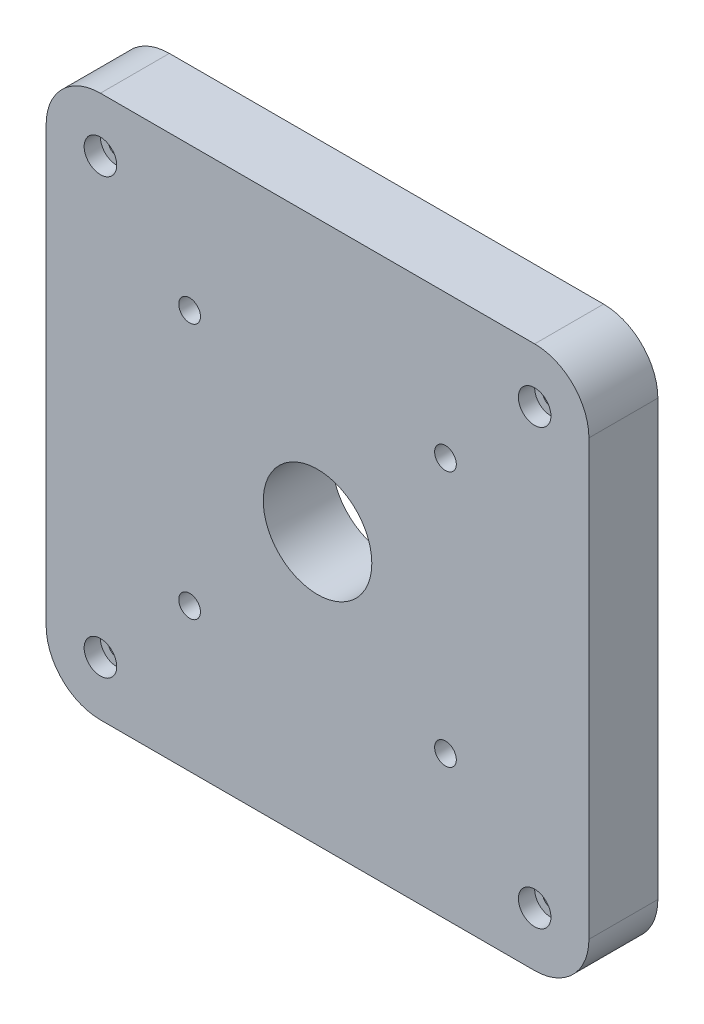
ISO-10303-21;
HEADER;
FILE_DESCRIPTION(('STEP AP214'),'2;1');
FILE_NAME('part.step','',(''),(''),'','','');
FILE_SCHEMA(('AUTOMOTIVE_DESIGN { 1 0 10303 214 1 1 1 1 }'));
ENDSEC;
DATA;
#1=APPLICATION_CONTEXT('core data for automotive mechanical design processes');
#2=APPLICATION_PROTOCOL_DEFINITION('international standard','automotive_design',2000,#1);
#3=PRODUCT_CONTEXT('',#1,'mechanical');
#4=PRODUCT('Part','Part','',(#3));
#5=PRODUCT_RELATED_PRODUCT_CATEGORY('part','',(#4));
#6=PRODUCT_DEFINITION_FORMATION('','',#4);
#7=PRODUCT_DEFINITION_CONTEXT('part definition',#1,'design');
#8=PRODUCT_DEFINITION('design','',#6,#7);
#9=PRODUCT_DEFINITION_SHAPE('','',#8);
#10=(LENGTH_UNIT() NAMED_UNIT(*) SI_UNIT(.MILLI.,.METRE.));
#11=(NAMED_UNIT(*) PLANE_ANGLE_UNIT() SI_UNIT($,.RADIAN.));
#12=(NAMED_UNIT(*) SI_UNIT($,.STERADIAN.) SOLID_ANGLE_UNIT());
#13=UNCERTAINTY_MEASURE_WITH_UNIT(LENGTH_MEASURE(1.E-05),#10,'distance_accuracy_value','');
#14=(GEOMETRIC_REPRESENTATION_CONTEXT(3) GLOBAL_UNCERTAINTY_ASSIGNED_CONTEXT((#13)) GLOBAL_UNIT_ASSIGNED_CONTEXT((#10,
#11,#12)) REPRESENTATION_CONTEXT('',''));
#15=CARTESIAN_POINT('',(0.,0.,0.));
#16=DIRECTION('',(0.,0.,1.));
#17=DIRECTION('',(1.,0.,0.));
#18=AXIS2_PLACEMENT_3D('',#15,#16,#17);
#19=CARTESIAN_POINT('',(26.43,73.57,-18.3));
#20=DIRECTION('',(0.,0.,1.));
#21=DIRECTION('',(1.,0.,0.));
#22=AXIS2_PLACEMENT_3D('',#19,#20,#21);
#23=CYLINDRICAL_SURFACE('',#22,2.);
#24=CARTESIAN_POINT('',(26.43,73.57,12.7));
#25=DIRECTION('',(0.,0.,1.));
#26=DIRECTION('',(1.,0.,0.));
#27=AXIS2_PLACEMENT_3D('',#24,#25,#26);
#28=CIRCLE('',#27,2.);
#29=CARTESIAN_POINT('',(28.43,73.57,12.7));
#30=VERTEX_POINT('',#29);
#31=EDGE_CURVE('E245',#30,#30,#28,.T.);
#32=ORIENTED_EDGE('',*,*,#31,.T.);
#33=EDGE_LOOP('',(#32));
#34=FACE_BOUND('',#33,.T.);
#35=CARTESIAN_POINT('',(26.43,73.57,3.));
#36=DIRECTION('',(0.,0.,-1.));
#37=DIRECTION('',(-1.,0.,0.));
#38=AXIS2_PLACEMENT_3D('',#35,#36,#37);
#39=CIRCLE('',#38,2.);
#40=CARTESIAN_POINT('',(24.43,73.57,3.));
#41=VERTEX_POINT('',#40);
#42=EDGE_CURVE('E47',#41,#41,#39,.F.);
#43=ORIENTED_EDGE('',*,*,#42,.F.);
#44=EDGE_LOOP('',(#43));
#45=FACE_BOUND('',#44,.T.);
#46=ADVANCED_FACE('F43',(#34,#45),#23,.F.);
#47=CARTESIAN_POINT('',(73.57,73.57,-18.3));
#48=DIRECTION('',(0.,0.,1.));
#49=DIRECTION('',(1.,0.,0.));
#50=AXIS2_PLACEMENT_3D('',#47,#48,#49);
#51=CYLINDRICAL_SURFACE('',#50,2.);
#52=CARTESIAN_POINT('',(73.57,73.57,12.7));
#53=DIRECTION('',(0.,0.,1.));
#54=DIRECTION('',(1.,0.,0.));
#55=AXIS2_PLACEMENT_3D('',#52,#53,#54);
#56=CIRCLE('',#55,2.);
#57=CARTESIAN_POINT('',(75.57,73.57,12.7));
#58=VERTEX_POINT('',#57);
#59=EDGE_CURVE('E249',#58,#58,#56,.T.);
#60=ORIENTED_EDGE('',*,*,#59,.T.);
#61=EDGE_LOOP('',(#60));
#62=FACE_BOUND('',#61,.T.);
#63=CARTESIAN_POINT('',(73.57,73.57,3.));
#64=DIRECTION('',(0.,0.,-1.));
#65=DIRECTION('',(-1.,0.,0.));
#66=AXIS2_PLACEMENT_3D('',#63,#64,#65);
#67=CIRCLE('',#66,2.);
#68=CARTESIAN_POINT('',(71.57,73.57,3.));
#69=VERTEX_POINT('',#68);
#70=EDGE_CURVE('E220',#69,#69,#67,.F.);
#71=ORIENTED_EDGE('',*,*,#70,.F.);
#72=EDGE_LOOP('',(#71));
#73=FACE_BOUND('',#72,.T.);
#74=ADVANCED_FACE('F376',(#62,#73),#51,.F.);
#75=CARTESIAN_POINT('',(26.43,26.43,-18.3));
#76=DIRECTION('',(0.,0.,1.));
#77=DIRECTION('',(1.,0.,0.));
#78=AXIS2_PLACEMENT_3D('',#75,#76,#77);
#79=CYLINDRICAL_SURFACE('',#78,2.);
#80=CARTESIAN_POINT('',(26.43,26.43,12.7));
#81=DIRECTION('',(0.,0.,1.));
#82=DIRECTION('',(1.,0.,0.));
#83=AXIS2_PLACEMENT_3D('',#80,#81,#82);
#84=CIRCLE('',#83,2.);
#85=CARTESIAN_POINT('',(28.43,26.43,12.7));
#86=VERTEX_POINT('',#85);
#87=EDGE_CURVE('E253',#86,#86,#84,.T.);
#88=ORIENTED_EDGE('',*,*,#87,.T.);
#89=EDGE_LOOP('',(#88));
#90=FACE_BOUND('',#89,.T.);
#91=CARTESIAN_POINT('',(26.43,26.43,3.));
#92=DIRECTION('',(0.,0.,-1.));
#93=DIRECTION('',(-1.,0.,0.));
#94=AXIS2_PLACEMENT_3D('',#91,#92,#93);
#95=CIRCLE('',#94,2.);
#96=CARTESIAN_POINT('',(24.43,26.43,3.));
#97=VERTEX_POINT('',#96);
#98=EDGE_CURVE('E216',#97,#97,#95,.F.);
#99=ORIENTED_EDGE('',*,*,#98,.F.);
#100=EDGE_LOOP('',(#99));
#101=FACE_BOUND('',#100,.T.);
#102=ADVANCED_FACE('F382',(#90,#101),#79,.F.);
#103=CARTESIAN_POINT('',(73.57,26.43,-18.3));
#104=DIRECTION('',(0.,0.,1.));
#105=DIRECTION('',(1.,0.,0.));
#106=AXIS2_PLACEMENT_3D('',#103,#104,#105);
#107=CYLINDRICAL_SURFACE('',#106,2.);
#108=CARTESIAN_POINT('',(73.57,26.43,12.7));
#109=DIRECTION('',(0.,0.,1.));
#110=DIRECTION('',(1.,0.,0.));
#111=AXIS2_PLACEMENT_3D('',#108,#109,#110);
#112=CIRCLE('',#111,2.);
#113=CARTESIAN_POINT('',(75.57,26.43,12.7));
#114=VERTEX_POINT('',#113);
#115=EDGE_CURVE('E211',#114,#114,#112,.T.);
#116=ORIENTED_EDGE('',*,*,#115,.T.);
#117=EDGE_LOOP('',(#116));
#118=FACE_BOUND('',#117,.T.);
#119=CARTESIAN_POINT('',(73.57,26.43,3.));
#120=DIRECTION('',(0.,0.,-1.));
#121=DIRECTION('',(-1.,0.,0.));
#122=AXIS2_PLACEMENT_3D('',#119,#120,#121);
#123=CIRCLE('',#122,2.);
#124=CARTESIAN_POINT('',(71.57,26.43,3.));
#125=VERTEX_POINT('',#124);
#126=EDGE_CURVE('E212',#125,#125,#123,.F.);
#127=ORIENTED_EDGE('',*,*,#126,.F.);
#128=EDGE_LOOP('',(#127));
#129=FACE_BOUND('',#128,.T.);
#130=ADVANCED_FACE('F392',(#118,#129),#107,.F.);
#131=CARTESIAN_POINT('',(90.,90.,12.7));
#132=DIRECTION('',(0.,0.,-1.));
#133=DIRECTION('',(-1.,0.,0.));
#134=AXIS2_PLACEMENT_3D('',#131,#132,#133);
#135=CYLINDRICAL_SURFACE('',#134,9.99999999999999);
#136=CARTESIAN_POINT('',(90.,90.,0.));
#137=DIRECTION('',(0.,0.,1.));
#138=DIRECTION('',(-1.,0.,0.));
#139=AXIS2_PLACEMENT_3D('',#136,#137,#138);
#140=CIRCLE('',#139,9.99999999999999);
#141=CARTESIAN_POINT('',(100.,89.9999999999999,0.));
#142=VERTEX_POINT('',#141);
#143=CARTESIAN_POINT('',(89.9999999999999,100.,0.));
#144=VERTEX_POINT('',#143);
#145=EDGE_CURVE('E147',#142,#144,#140,.T.);
#146=ORIENTED_EDGE('',*,*,#145,.T.);
#147=DIRECTION('',(0.,0.,-1.));
#148=VECTOR('',#147,1.);
#149=CARTESIAN_POINT('',(89.9999999999999,100.,12.7));
#150=LINE('',#149,#148);
#151=CARTESIAN_POINT('',(89.9999999999999,100.,12.7));
#152=VERTEX_POINT('',#151);
#153=EDGE_CURVE('E11',#152,#144,#150,.T.);
#154=ORIENTED_EDGE('',*,*,#153,.F.);
#155=CARTESIAN_POINT('',(90.,90.,12.7));
#156=DIRECTION('',(0.,0.,1.));
#157=DIRECTION('',(-1.,0.,0.));
#158=AXIS2_PLACEMENT_3D('',#155,#156,#157);
#159=CIRCLE('',#158,9.99999999999999);
#160=CARTESIAN_POINT('',(100.,89.9999999999999,12.7));
#161=VERTEX_POINT('',#160);
#162=EDGE_CURVE('E170',#161,#152,#159,.T.);
#163=ORIENTED_EDGE('',*,*,#162,.F.);
#164=DIRECTION('',(0.,0.,-1.));
#165=VECTOR('',#164,1.);
#166=CARTESIAN_POINT('',(100.,89.9999999999999,12.7));
#167=LINE('',#166,#165);
#168=EDGE_CURVE('E143',#161,#142,#167,.T.);
#169=ORIENTED_EDGE('',*,*,#168,.T.);
#170=EDGE_LOOP('',(#146,#154,#163,#169));
#171=FACE_BOUND('',#170,.T.);
#172=ADVANCED_FACE('F45',(#171),#135,.T.);
#173=CARTESIAN_POINT('',(10.0000000000001,100.,12.7));
#174=DIRECTION('',(0.,-1.,0.));
#175=DIRECTION('',(0.,0.,-1.));
#176=AXIS2_PLACEMENT_3D('',#173,#174,#175);
#177=PLANE('',#176);
#178=DIRECTION('',(-1.,0.,0.));
#179=VECTOR('',#178,1.);
#180=CARTESIAN_POINT('',(10.0000000000001,100.,0.));
#181=LINE('',#180,#179);
#182=CARTESIAN_POINT('',(10.0000000000001,100.,0.));
#183=VERTEX_POINT('',#182);
#184=EDGE_CURVE('E151',#144,#183,#181,.T.);
#185=ORIENTED_EDGE('',*,*,#184,.T.);
#186=DIRECTION('',(0.,0.,-1.));
#187=VECTOR('',#186,1.);
#188=CARTESIAN_POINT('',(10.0000000000001,100.,12.7));
#189=LINE('',#188,#187);
#190=CARTESIAN_POINT('',(10.0000000000001,100.,12.7));
#191=VERTEX_POINT('',#190);
#192=EDGE_CURVE('E54',#191,#183,#189,.T.);
#193=ORIENTED_EDGE('',*,*,#192,.F.);
#194=DIRECTION('',(-1.,0.,0.));
#195=VECTOR('',#194,1.);
#196=CARTESIAN_POINT('',(10.0000000000001,100.,12.7));
#197=LINE('',#196,#195);
#198=EDGE_CURVE('E106',#152,#191,#197,.T.);
#199=ORIENTED_EDGE('',*,*,#198,.F.);
#200=ORIENTED_EDGE('',*,*,#153,.T.);
#201=EDGE_LOOP('',(#185,#193,#199,#200));
#202=FACE_BOUND('',#201,.T.);
#203=ADVANCED_FACE('F738',(#202),#177,.F.);
#204=CARTESIAN_POINT('',(10.,90.,12.7));
#205=DIRECTION('',(0.,0.,-1.));
#206=DIRECTION('',(-1.,0.,0.));
#207=AXIS2_PLACEMENT_3D('',#204,#205,#206);
#208=CYLINDRICAL_SURFACE('',#207,10.);
#209=CARTESIAN_POINT('',(10.,90.,0.));
#210=DIRECTION('',(0.,0.,1.));
#211=DIRECTION('',(-1.,0.,0.));
#212=AXIS2_PLACEMENT_3D('',#209,#210,#211);
#213=CIRCLE('',#212,10.);
#214=CARTESIAN_POINT('',(0.,89.9999999999999,0.));
#215=VERTEX_POINT('',#214);
#216=EDGE_CURVE('E155',#183,#215,#213,.T.);
#217=ORIENTED_EDGE('',*,*,#216,.T.);
#218=DIRECTION('',(0.,0.,-1.));
#219=VECTOR('',#218,1.);
#220=CARTESIAN_POINT('',(0.,89.9999999999999,12.7));
#221=LINE('',#220,#219);
#222=CARTESIAN_POINT('',(0.,89.9999999999999,12.7));
#223=VERTEX_POINT('',#222);
#224=EDGE_CURVE('E181',#223,#215,#221,.T.);
#225=ORIENTED_EDGE('',*,*,#224,.F.);
#226=CARTESIAN_POINT('',(10.,90.,12.7));
#227=DIRECTION('',(0.,0.,1.));
#228=DIRECTION('',(-1.,0.,0.));
#229=AXIS2_PLACEMENT_3D('',#226,#227,#228);
#230=CIRCLE('',#229,10.);
#231=EDGE_CURVE('E297',#191,#223,#230,.T.);
#232=ORIENTED_EDGE('',*,*,#231,.F.);
#233=ORIENTED_EDGE('',*,*,#192,.T.);
#234=EDGE_LOOP('',(#217,#225,#232,#233));
#235=FACE_BOUND('',#234,.T.);
#236=ADVANCED_FACE('F727',(#235),#208,.T.);
#237=CARTESIAN_POINT('',(0.,10.0000000000001,12.7));
#238=DIRECTION('',(1.,0.,0.));
#239=DIRECTION('',(0.,0.,-1.));
#240=AXIS2_PLACEMENT_3D('',#237,#238,#239);
#241=PLANE('',#240);
#242=DIRECTION('',(0.,-1.,0.));
#243=VECTOR('',#242,1.);
#244=CARTESIAN_POINT('',(0.,10.0000000000001,0.));
#245=LINE('',#244,#243);
#246=CARTESIAN_POINT('',(0.,10.0000000000001,0.));
#247=VERTEX_POINT('',#246);
#248=EDGE_CURVE('E158',#215,#247,#245,.T.);
#249=ORIENTED_EDGE('',*,*,#248,.T.);
#250=DIRECTION('',(0.,0.,-1.));
#251=VECTOR('',#250,1.);
#252=CARTESIAN_POINT('',(0.,10.0000000000001,12.7));
#253=LINE('',#252,#251);
#254=CARTESIAN_POINT('',(0.,10.0000000000001,12.7));
#255=VERTEX_POINT('',#254);
#256=EDGE_CURVE('E177',#255,#247,#253,.T.);
#257=ORIENTED_EDGE('',*,*,#256,.F.);
#258=DIRECTION('',(0.,-1.,0.));
#259=VECTOR('',#258,1.);
#260=CARTESIAN_POINT('',(0.,10.0000000000001,12.7));
#261=LINE('',#260,#259);
#262=EDGE_CURVE('E300',#223,#255,#261,.T.);
#263=ORIENTED_EDGE('',*,*,#262,.F.);
#264=ORIENTED_EDGE('',*,*,#224,.T.);
#265=EDGE_LOOP('',(#249,#257,#263,#264));
#266=FACE_BOUND('',#265,.T.);
#267=ADVANCED_FACE('F716',(#266),#241,.F.);
#268=CARTESIAN_POINT('',(10.,10.,12.7));
#269=DIRECTION('',(0.,0.,-1.));
#270=DIRECTION('',(-1.,0.,0.));
#271=AXIS2_PLACEMENT_3D('',#268,#269,#270);
#272=CYLINDRICAL_SURFACE('',#271,10.);
#273=CARTESIAN_POINT('',(10.,10.,0.));
#274=DIRECTION('',(0.,0.,1.));
#275=DIRECTION('',(-1.,0.,0.));
#276=AXIS2_PLACEMENT_3D('',#273,#274,#275);
#277=CIRCLE('',#276,10.);
#278=CARTESIAN_POINT('',(10.0000000000001,0.,0.));
#279=VERTEX_POINT('',#278);
#280=EDGE_CURVE('E161',#247,#279,#277,.T.);
#281=ORIENTED_EDGE('',*,*,#280,.T.);
#282=DIRECTION('',(0.,0.,-1.));
#283=VECTOR('',#282,1.);
#284=CARTESIAN_POINT('',(10.0000000000001,0.,12.7));
#285=LINE('',#284,#283);
#286=CARTESIAN_POINT('',(10.0000000000001,0.,12.7));
#287=VERTEX_POINT('',#286);
#288=EDGE_CURVE('E136',#287,#279,#285,.T.);
#289=ORIENTED_EDGE('',*,*,#288,.F.);
#290=CARTESIAN_POINT('',(10.,10.,12.7));
#291=DIRECTION('',(0.,0.,1.));
#292=DIRECTION('',(-1.,0.,0.));
#293=AXIS2_PLACEMENT_3D('',#290,#291,#292);
#294=CIRCLE('',#293,10.);
#295=EDGE_CURVE('E125',#255,#287,#294,.T.);
#296=ORIENTED_EDGE('',*,*,#295,.F.);
#297=ORIENTED_EDGE('',*,*,#256,.T.);
#298=EDGE_LOOP('',(#281,#289,#296,#297));
#299=FACE_BOUND('',#298,.T.);
#300=ADVANCED_FACE('F706',(#299),#272,.T.);
#301=CARTESIAN_POINT('',(10.0000000000001,0.,12.7));
#302=DIRECTION('',(0.,1.,0.));
#303=DIRECTION('',(0.,0.,1.));
#304=AXIS2_PLACEMENT_3D('',#301,#302,#303);
#305=PLANE('',#304);
#306=DIRECTION('',(1.,0.,0.));
#307=VECTOR('',#306,1.);
#308=CARTESIAN_POINT('',(10.0000000000001,0.,0.));
#309=LINE('',#308,#307);
#310=CARTESIAN_POINT('',(89.9999999999999,0.,0.));
#311=VERTEX_POINT('',#310);
#312=EDGE_CURVE('E134',#279,#311,#309,.T.);
#313=ORIENTED_EDGE('',*,*,#312,.T.);
#314=DIRECTION('',(0.,0.,-1.));
#315=VECTOR('',#314,1.);
#316=CARTESIAN_POINT('',(89.9999999999999,0.,12.7));
#317=LINE('',#316,#315);
#318=CARTESIAN_POINT('',(89.9999999999999,0.,12.7));
#319=VERTEX_POINT('',#318);
#320=EDGE_CURVE('E131',#319,#311,#317,.T.);
#321=ORIENTED_EDGE('',*,*,#320,.F.);
#322=DIRECTION('',(1.,0.,0.));
#323=VECTOR('',#322,1.);
#324=CARTESIAN_POINT('',(10.0000000000001,0.,12.7));
#325=LINE('',#324,#323);
#326=EDGE_CURVE('E119',#287,#319,#325,.T.);
#327=ORIENTED_EDGE('',*,*,#326,.F.);
#328=ORIENTED_EDGE('',*,*,#288,.T.);
#329=EDGE_LOOP('',(#313,#321,#327,#328));
#330=FACE_BOUND('',#329,.T.);
#331=ADVANCED_FACE('F132',(#330),#305,.F.);
#332=CARTESIAN_POINT('',(90.,10.,12.7));
#333=DIRECTION('',(0.,0.,-1.));
#334=DIRECTION('',(-1.,0.,0.));
#335=AXIS2_PLACEMENT_3D('',#332,#333,#334);
#336=CYLINDRICAL_SURFACE('',#335,10.);
#337=CARTESIAN_POINT('',(90.,10.,0.));
#338=DIRECTION('',(0.,0.,1.));
#339=DIRECTION('',(1.,0.,0.));
#340=AXIS2_PLACEMENT_3D('',#337,#338,#339);
#341=CIRCLE('',#340,10.);
#342=CARTESIAN_POINT('',(100.,10.,0.));
#343=VERTEX_POINT('',#342);
#344=EDGE_CURVE('E92',#311,#343,#341,.T.);
#345=ORIENTED_EDGE('',*,*,#344,.T.);
#346=DIRECTION('',(0.,0.,-1.));
#347=VECTOR('',#346,1.);
#348=CARTESIAN_POINT('',(100.,10.,12.7));
#349=LINE('',#348,#347);
#350=CARTESIAN_POINT('',(100.,10.,12.7));
#351=VERTEX_POINT('',#350);
#352=EDGE_CURVE('E137',#351,#343,#349,.T.);
#353=ORIENTED_EDGE('',*,*,#352,.F.);
#354=CARTESIAN_POINT('',(90.,10.,12.7));
#355=DIRECTION('',(0.,0.,1.));
#356=DIRECTION('',(1.,0.,0.));
#357=AXIS2_PLACEMENT_3D('',#354,#355,#356);
#358=CIRCLE('',#357,10.);
#359=EDGE_CURVE('E123',#319,#351,#358,.T.);
#360=ORIENTED_EDGE('',*,*,#359,.F.);
#361=ORIENTED_EDGE('',*,*,#320,.T.);
#362=EDGE_LOOP('',(#345,#353,#360,#361));
#363=FACE_BOUND('',#362,.T.);
#364=ADVANCED_FACE('F139',(#363),#336,.T.);
#365=CARTESIAN_POINT('',(100.,10.0000000000001,12.7));
#366=DIRECTION('',(-1.,0.,0.));
#367=DIRECTION('',(0.,0.,1.));
#368=AXIS2_PLACEMENT_3D('',#365,#366,#367);
#369=PLANE('',#368);
#370=DIRECTION('',(0.,1.,0.));
#371=VECTOR('',#370,1.);
#372=CARTESIAN_POINT('',(100.,10.0000000000001,0.));
#373=LINE('',#372,#371);
#374=EDGE_CURVE('E98',#343,#142,#373,.T.);
#375=ORIENTED_EDGE('',*,*,#374,.T.);
#376=ORIENTED_EDGE('',*,*,#168,.F.);
#377=DIRECTION('',(0.,1.,0.));
#378=VECTOR('',#377,1.);
#379=CARTESIAN_POINT('',(100.,10.0000000000001,12.7));
#380=LINE('',#379,#378);
#381=EDGE_CURVE('E63',#351,#161,#380,.T.);
#382=ORIENTED_EDGE('',*,*,#381,.F.);
#383=ORIENTED_EDGE('',*,*,#352,.T.);
#384=EDGE_LOOP('',(#375,#376,#382,#383));
#385=FACE_BOUND('',#384,.T.);
#386=ADVANCED_FACE('F365',(#385),#369,.F.);
#387=CARTESIAN_POINT('',(90.,90.,12.7));
#388=DIRECTION('',(0.,0.,-1.));
#389=DIRECTION('',(-1.,0.,0.));
#390=AXIS2_PLACEMENT_3D('',#387,#388,#389);
#391=PLANE('',#390);
#392=ORIENTED_EDGE('',*,*,#115,.F.);
#393=EDGE_LOOP('',(#392));
#394=FACE_BOUND('',#393,.T.);
#395=ORIENTED_EDGE('',*,*,#87,.F.);
#396=EDGE_LOOP('',(#395));
#397=FACE_BOUND('',#396,.T.);
#398=ORIENTED_EDGE('',*,*,#59,.F.);
#399=EDGE_LOOP('',(#398));
#400=FACE_BOUND('',#399,.T.);
#401=ORIENTED_EDGE('',*,*,#31,.F.);
#402=EDGE_LOOP('',(#401));
#403=FACE_BOUND('',#402,.T.);
#404=CARTESIAN_POINT('',(50.,50.,12.7));
#405=DIRECTION('',(0.,0.,1.));
#406=DIRECTION('',(1.,0.,0.));
#407=AXIS2_PLACEMENT_3D('',#404,#405,#406);
#408=CIRCLE('',#407,9.99999999999999);
#409=CARTESIAN_POINT('',(60.,50.,12.7));
#410=VERTEX_POINT('',#409);
#411=EDGE_CURVE('E193',#410,#410,#408,.T.);
#412=ORIENTED_EDGE('',*,*,#411,.F.);
#413=EDGE_LOOP('',(#412));
#414=FACE_BOUND('',#413,.T.);
#415=CARTESIAN_POINT('',(10.,10.,12.7));
#416=DIRECTION('',(0.,0.,1.));
#417=DIRECTION('',(1.,0.,0.));
#418=AXIS2_PLACEMENT_3D('',#415,#416,#417);
#419=CIRCLE('',#418,3.);
#420=CARTESIAN_POINT('',(13.,10.,12.7));
#421=VERTEX_POINT('',#420);
#422=EDGE_CURVE('E271',#421,#421,#419,.T.);
#423=ORIENTED_EDGE('',*,*,#422,.F.);
#424=EDGE_LOOP('',(#423));
#425=FACE_BOUND('',#424,.T.);
#426=CARTESIAN_POINT('',(90.,90.,12.7));
#427=DIRECTION('',(0.,0.,1.));
#428=DIRECTION('',(1.,0.,0.));
#429=AXIS2_PLACEMENT_3D('',#426,#427,#428);
#430=CIRCLE('',#429,3.00000000000001);
#431=CARTESIAN_POINT('',(93.,90.,12.7));
#432=VERTEX_POINT('',#431);
#433=EDGE_CURVE('E280',#432,#432,#430,.T.);
#434=ORIENTED_EDGE('',*,*,#433,.F.);
#435=EDGE_LOOP('',(#434));
#436=FACE_BOUND('',#435,.T.);
#437=CARTESIAN_POINT('',(90.,10.,12.7));
#438=DIRECTION('',(0.,0.,1.));
#439=DIRECTION('',(1.,0.,0.));
#440=AXIS2_PLACEMENT_3D('',#437,#438,#439);
#441=CIRCLE('',#440,3.00000000000001);
#442=CARTESIAN_POINT('',(93.,10.,12.7));
#443=VERTEX_POINT('',#442);
#444=EDGE_CURVE('E263',#443,#443,#441,.T.);
#445=ORIENTED_EDGE('',*,*,#444,.F.);
#446=EDGE_LOOP('',(#445));
#447=FACE_BOUND('',#446,.T.);
#448=CARTESIAN_POINT('',(10.,90.,12.7));
#449=DIRECTION('',(0.,0.,1.));
#450=DIRECTION('',(1.,0.,0.));
#451=AXIS2_PLACEMENT_3D('',#448,#449,#450);
#452=CIRCLE('',#451,3.);
#453=CARTESIAN_POINT('',(13.,90.,12.7));
#454=VERTEX_POINT('',#453);
#455=EDGE_CURVE('E275',#454,#454,#452,.T.);
#456=ORIENTED_EDGE('',*,*,#455,.F.);
#457=EDGE_LOOP('',(#456));
#458=FACE_BOUND('',#457,.T.);
#459=ORIENTED_EDGE('',*,*,#162,.T.);
#460=ORIENTED_EDGE('',*,*,#198,.T.);
#461=ORIENTED_EDGE('',*,*,#231,.T.);
#462=ORIENTED_EDGE('',*,*,#262,.T.);
#463=ORIENTED_EDGE('',*,*,#295,.T.);
#464=ORIENTED_EDGE('',*,*,#326,.T.);
#465=ORIENTED_EDGE('',*,*,#359,.T.);
#466=ORIENTED_EDGE('',*,*,#381,.T.);
#467=EDGE_LOOP('',(#459,#460,#461,#462,#463,#464,#465,#466));
#468=FACE_BOUND('',#467,.T.);
#469=ADVANCED_FACE('F121',(#394,#397,#400,#403,#414,#425,#436,#447,#458,#468),#391,.F.);
#470=CARTESIAN_POINT('',(90.,90.,0.));
#471=DIRECTION('',(0.,0.,-1.));
#472=DIRECTION('',(-1.,0.,0.));
#473=AXIS2_PLACEMENT_3D('',#470,#471,#472);
#474=PLANE('',#473);
#475=CARTESIAN_POINT('',(73.57,26.43,0.));
#476=DIRECTION('',(0.,0.,-1.));
#477=DIRECTION('',(-1.,0.,0.));
#478=AXIS2_PLACEMENT_3D('',#475,#476,#477);
#479=CIRCLE('',#478,4.00000000000001);
#480=CARTESIAN_POINT('',(69.57,26.43,0.));
#481=VERTEX_POINT('',#480);
#482=EDGE_CURVE('E320',#481,#481,#479,.T.);
#483=ORIENTED_EDGE('',*,*,#482,.F.);
#484=EDGE_LOOP('',(#483));
#485=FACE_BOUND('',#484,.T.);
#486=CARTESIAN_POINT('',(26.43,26.43,0.));
#487=DIRECTION('',(0.,0.,-1.));
#488=DIRECTION('',(-1.,0.,0.));
#489=AXIS2_PLACEMENT_3D('',#486,#487,#488);
#490=CIRCLE('',#489,4.);
#491=CARTESIAN_POINT('',(22.43,26.43,0.));
#492=VERTEX_POINT('',#491);
#493=EDGE_CURVE('E328',#492,#492,#490,.T.);
#494=ORIENTED_EDGE('',*,*,#493,.F.);
#495=EDGE_LOOP('',(#494));
#496=FACE_BOUND('',#495,.T.);
#497=CARTESIAN_POINT('',(26.43,73.57,0.));
#498=DIRECTION('',(0.,0.,-1.));
#499=DIRECTION('',(-1.,0.,0.));
#500=AXIS2_PLACEMENT_3D('',#497,#498,#499);
#501=CIRCLE('',#500,4.);
#502=CARTESIAN_POINT('',(22.43,73.57,0.));
#503=VERTEX_POINT('',#502);
#504=EDGE_CURVE('E312',#503,#503,#501,.T.);
#505=ORIENTED_EDGE('',*,*,#504,.F.);
#506=EDGE_LOOP('',(#505));
#507=FACE_BOUND('',#506,.T.);
#508=CARTESIAN_POINT('',(73.57,73.57,0.));
#509=DIRECTION('',(0.,0.,-1.));
#510=DIRECTION('',(-1.,0.,0.));
#511=AXIS2_PLACEMENT_3D('',#508,#509,#510);
#512=CIRCLE('',#511,4.00000000000001);
#513=CARTESIAN_POINT('',(69.57,73.57,0.));
#514=VERTEX_POINT('',#513);
#515=EDGE_CURVE('E308',#514,#514,#512,.T.);
#516=ORIENTED_EDGE('',*,*,#515,.F.);
#517=EDGE_LOOP('',(#516));
#518=FACE_BOUND('',#517,.T.);
#519=CARTESIAN_POINT('',(10.,10.,0.));
#520=DIRECTION('',(0.,0.,-1.));
#521=DIRECTION('',(-1.,0.,0.));
#522=AXIS2_PLACEMENT_3D('',#519,#520,#521);
#523=CIRCLE('',#522,1.5);
#524=CARTESIAN_POINT('',(8.5,10.,0.));
#525=VERTEX_POINT('',#524);
#526=EDGE_CURVE('E207',#525,#525,#523,.T.);
#527=ORIENTED_EDGE('',*,*,#526,.F.);
#528=EDGE_LOOP('',(#527));
#529=FACE_BOUND('',#528,.T.);
#530=CARTESIAN_POINT('',(90.,10.,0.));
#531=DIRECTION('',(0.,0.,-1.));
#532=DIRECTION('',(-1.,0.,0.));
#533=AXIS2_PLACEMENT_3D('',#530,#531,#532);
#534=CIRCLE('',#533,1.5);
#535=CARTESIAN_POINT('',(88.5,10.,0.));
#536=VERTEX_POINT('',#535);
#537=EDGE_CURVE('E203',#536,#536,#534,.T.);
#538=ORIENTED_EDGE('',*,*,#537,.F.);
#539=EDGE_LOOP('',(#538));
#540=FACE_BOUND('',#539,.T.);
#541=CARTESIAN_POINT('',(90.,90.,0.));
#542=DIRECTION('',(0.,0.,-1.));
#543=DIRECTION('',(-1.,0.,0.));
#544=AXIS2_PLACEMENT_3D('',#541,#542,#543);
#545=CIRCLE('',#544,1.5);
#546=CARTESIAN_POINT('',(88.5,90.,0.));
#547=VERTEX_POINT('',#546);
#548=EDGE_CURVE('E198',#547,#547,#545,.T.);
#549=ORIENTED_EDGE('',*,*,#548,.F.);
#550=EDGE_LOOP('',(#549));
#551=FACE_BOUND('',#550,.T.);
#552=CARTESIAN_POINT('',(10.,90.,0.));
#553=DIRECTION('',(0.,0.,-1.));
#554=DIRECTION('',(-1.,0.,0.));
#555=AXIS2_PLACEMENT_3D('',#552,#553,#554);
#556=CIRCLE('',#555,1.5);
#557=CARTESIAN_POINT('',(8.50000000000001,90.,0.));
#558=VERTEX_POINT('',#557);
#559=EDGE_CURVE('E194',#558,#558,#556,.T.);
#560=ORIENTED_EDGE('',*,*,#559,.F.);
#561=EDGE_LOOP('',(#560));
#562=FACE_BOUND('',#561,.T.);
#563=CARTESIAN_POINT('',(50.,50.,0.));
#564=DIRECTION('',(0.,0.,-1.));
#565=DIRECTION('',(-1.,0.,0.));
#566=AXIS2_PLACEMENT_3D('',#563,#564,#565);
#567=CIRCLE('',#566,9.99999999999999);
#568=CARTESIAN_POINT('',(40.,50.,0.));
#569=VERTEX_POINT('',#568);
#570=EDGE_CURVE('E188',#569,#569,#567,.T.);
#571=ORIENTED_EDGE('',*,*,#570,.F.);
#572=EDGE_LOOP('',(#571));
#573=FACE_BOUND('',#572,.T.);
#574=ORIENTED_EDGE('',*,*,#145,.F.);
#575=ORIENTED_EDGE('',*,*,#374,.F.);
#576=ORIENTED_EDGE('',*,*,#344,.F.);
#577=ORIENTED_EDGE('',*,*,#312,.F.);
#578=ORIENTED_EDGE('',*,*,#280,.F.);
#579=ORIENTED_EDGE('',*,*,#248,.F.);
#580=ORIENTED_EDGE('',*,*,#216,.F.);
#581=ORIENTED_EDGE('',*,*,#184,.F.);
#582=EDGE_LOOP('',(#574,#575,#576,#577,#578,#579,#580,#581));
#583=FACE_BOUND('',#582,.T.);
#584=ADVANCED_FACE('F342',(#485,#496,#507,#518,#529,#540,#551,#562,#573,#583),#474,.T.);
#585=CARTESIAN_POINT('',(10.,90.,9.7));
#586=DIRECTION('',(0.,0.,1.));
#587=DIRECTION('',(1.,0.,0.));
#588=AXIS2_PLACEMENT_3D('',#585,#586,#587);
#589=CYLINDRICAL_SURFACE('',#588,3.);
#590=CARTESIAN_POINT('',(10.,90.,9.7));
#591=DIRECTION('',(0.,0.,1.));
#592=DIRECTION('',(1.,0.,0.));
#593=AXIS2_PLACEMENT_3D('',#590,#591,#592);
#594=CIRCLE('',#593,3.);
#595=CARTESIAN_POINT('',(13.,90.,9.7));
#596=VERTEX_POINT('',#595);
#597=EDGE_CURVE('E152',#596,#596,#594,.T.);
#598=ORIENTED_EDGE('',*,*,#597,.F.);
#599=EDGE_LOOP('',(#598));
#600=FACE_BOUND('',#599,.T.);
#601=ORIENTED_EDGE('',*,*,#455,.T.);
#602=EDGE_LOOP('',(#601));
#603=FACE_BOUND('',#602,.T.);
#604=ADVANCED_FACE('F345',(#600,#603),#589,.F.);
#605=CARTESIAN_POINT('',(10.,90.,9.7));
#606=DIRECTION('',(0.,0.,1.));
#607=DIRECTION('',(1.,0.,0.));
#608=AXIS2_PLACEMENT_3D('',#605,#606,#607);
#609=PLANE('',#608);
#610=CARTESIAN_POINT('',(10.,90.,9.7));
#611=DIRECTION('',(0.,0.,1.));
#612=DIRECTION('',(1.,0.,0.));
#613=AXIS2_PLACEMENT_3D('',#610,#611,#612);
#614=CIRCLE('',#613,1.5);
#615=CARTESIAN_POINT('',(11.5,90.,9.7));
#616=VERTEX_POINT('',#615);
#617=EDGE_CURVE('E199',#616,#616,#614,.T.);
#618=ORIENTED_EDGE('',*,*,#617,.F.);
#619=EDGE_LOOP('',(#618));
#620=FACE_BOUND('',#619,.T.);
#621=ORIENTED_EDGE('',*,*,#597,.T.);
#622=EDGE_LOOP('',(#621));
#623=FACE_BOUND('',#622,.T.);
#624=ADVANCED_FACE('F406',(#620,#623),#609,.T.);
#625=CARTESIAN_POINT('',(90.,10.,9.7));
#626=DIRECTION('',(0.,0.,1.));
#627=DIRECTION('',(1.,0.,0.));
#628=AXIS2_PLACEMENT_3D('',#625,#626,#627);
#629=CYLINDRICAL_SURFACE('',#628,3.00000000000001);
#630=CARTESIAN_POINT('',(90.,10.,9.7));
#631=DIRECTION('',(0.,0.,1.));
#632=DIRECTION('',(1.,0.,0.));
#633=AXIS2_PLACEMENT_3D('',#630,#631,#632);
#634=CIRCLE('',#633,3.00000000000001);
#635=CARTESIAN_POINT('',(93.,10.,9.7));
#636=VERTEX_POINT('',#635);
#637=EDGE_CURVE('E192',#636,#636,#634,.T.);
#638=ORIENTED_EDGE('',*,*,#637,.F.);
#639=EDGE_LOOP('',(#638));
#640=FACE_BOUND('',#639,.T.);
#641=ORIENTED_EDGE('',*,*,#444,.T.);
#642=EDGE_LOOP('',(#641));
#643=FACE_BOUND('',#642,.T.);
#644=ADVANCED_FACE('F402',(#640,#643),#629,.F.);
#645=CARTESIAN_POINT('',(90.,10.,9.7));
#646=DIRECTION('',(0.,0.,1.));
#647=DIRECTION('',(1.,0.,0.));
#648=AXIS2_PLACEMENT_3D('',#645,#646,#647);
#649=PLANE('',#648);
#650=CARTESIAN_POINT('',(90.,10.,9.7));
#651=DIRECTION('',(0.,0.,1.));
#652=DIRECTION('',(1.,0.,0.));
#653=AXIS2_PLACEMENT_3D('',#650,#651,#652);
#654=CIRCLE('',#653,1.5);
#655=CARTESIAN_POINT('',(91.5,10.,9.7));
#656=VERTEX_POINT('',#655);
#657=EDGE_CURVE('E232',#656,#656,#654,.T.);
#658=ORIENTED_EDGE('',*,*,#657,.F.);
#659=EDGE_LOOP('',(#658));
#660=FACE_BOUND('',#659,.T.);
#661=ORIENTED_EDGE('',*,*,#637,.T.);
#662=EDGE_LOOP('',(#661));
#663=FACE_BOUND('',#662,.T.);
#664=ADVANCED_FACE('F405',(#660,#663),#649,.T.);
#665=CARTESIAN_POINT('',(90.,90.,9.7));
#666=DIRECTION('',(0.,0.,1.));
#667=DIRECTION('',(1.,0.,0.));
#668=AXIS2_PLACEMENT_3D('',#665,#666,#667);
#669=CYLINDRICAL_SURFACE('',#668,3.00000000000001);
#670=CARTESIAN_POINT('',(90.,90.,9.7));
#671=DIRECTION('',(0.,0.,1.));
#672=DIRECTION('',(1.,0.,0.));
#673=AXIS2_PLACEMENT_3D('',#670,#671,#672);
#674=CIRCLE('',#673,3.00000000000001);
#675=CARTESIAN_POINT('',(93.,90.,9.7));
#676=VERTEX_POINT('',#675);
#677=EDGE_CURVE('E267',#676,#676,#674,.T.);
#678=ORIENTED_EDGE('',*,*,#677,.F.);
#679=EDGE_LOOP('',(#678));
#680=FACE_BOUND('',#679,.T.);
#681=ORIENTED_EDGE('',*,*,#433,.T.);
#682=EDGE_LOOP('',(#681));
#683=FACE_BOUND('',#682,.T.);
#684=ADVANCED_FACE('F410',(#680,#683),#669,.F.);
#685=CARTESIAN_POINT('',(90.,90.,9.7));
#686=DIRECTION('',(0.,0.,1.));
#687=DIRECTION('',(1.,0.,0.));
#688=AXIS2_PLACEMENT_3D('',#685,#686,#687);
#689=PLANE('',#688);
#690=CARTESIAN_POINT('',(90.,90.,9.7));
#691=DIRECTION('',(0.,0.,1.));
#692=DIRECTION('',(1.,0.,0.));
#693=AXIS2_PLACEMENT_3D('',#690,#691,#692);
#694=CIRCLE('',#693,1.5);
#695=CARTESIAN_POINT('',(91.5,90.,9.7));
#696=VERTEX_POINT('',#695);
#697=EDGE_CURVE('E238',#696,#696,#694,.T.);
#698=ORIENTED_EDGE('',*,*,#697,.F.);
#699=EDGE_LOOP('',(#698));
#700=FACE_BOUND('',#699,.T.);
#701=ORIENTED_EDGE('',*,*,#677,.T.);
#702=EDGE_LOOP('',(#701));
#703=FACE_BOUND('',#702,.T.);
#704=ADVANCED_FACE('F415',(#700,#703),#689,.T.);
#705=CARTESIAN_POINT('',(10.,10.,9.7));
#706=DIRECTION('',(0.,0.,1.));
#707=DIRECTION('',(1.,0.,0.));
#708=AXIS2_PLACEMENT_3D('',#705,#706,#707);
#709=CYLINDRICAL_SURFACE('',#708,3.);
#710=CARTESIAN_POINT('',(10.,10.,9.7));
#711=DIRECTION('',(0.,0.,1.));
#712=DIRECTION('',(1.,0.,0.));
#713=AXIS2_PLACEMENT_3D('',#710,#711,#712);
#714=CIRCLE('',#713,3.);
#715=CARTESIAN_POINT('',(13.,10.,9.7));
#716=VERTEX_POINT('',#715);
#717=EDGE_CURVE('E276',#716,#716,#714,.T.);
#718=ORIENTED_EDGE('',*,*,#717,.F.);
#719=EDGE_LOOP('',(#718));
#720=FACE_BOUND('',#719,.T.);
#721=ORIENTED_EDGE('',*,*,#422,.T.);
#722=EDGE_LOOP('',(#721));
#723=FACE_BOUND('',#722,.T.);
#724=ADVANCED_FACE('F412',(#720,#723),#709,.F.);
#725=CARTESIAN_POINT('',(10.,10.,9.7));
#726=DIRECTION('',(0.,0.,1.));
#727=DIRECTION('',(1.,0.,0.));
#728=AXIS2_PLACEMENT_3D('',#725,#726,#727);
#729=PLANE('',#728);
#730=CARTESIAN_POINT('',(10.,10.,9.7));
#731=DIRECTION('',(0.,0.,1.));
#732=DIRECTION('',(1.,0.,0.));
#733=AXIS2_PLACEMENT_3D('',#730,#731,#732);
#734=CIRCLE('',#733,1.5);
#735=CARTESIAN_POINT('',(11.5,10.,9.7));
#736=VERTEX_POINT('',#735);
#737=EDGE_CURVE('E227',#736,#736,#734,.T.);
#738=ORIENTED_EDGE('',*,*,#737,.F.);
#739=EDGE_LOOP('',(#738));
#740=FACE_BOUND('',#739,.T.);
#741=ORIENTED_EDGE('',*,*,#717,.T.);
#742=EDGE_LOOP('',(#741));
#743=FACE_BOUND('',#742,.T.);
#744=ADVANCED_FACE('F400',(#740,#743),#729,.T.);
#745=CARTESIAN_POINT('',(50.,50.,-18.3));
#746=DIRECTION('',(0.,0.,1.));
#747=DIRECTION('',(1.,0.,0.));
#748=AXIS2_PLACEMENT_3D('',#745,#746,#747);
#749=CYLINDRICAL_SURFACE('',#748,9.99999999999999);
#750=ORIENTED_EDGE('',*,*,#570,.T.);
#751=EDGE_LOOP('',(#750));
#752=FACE_BOUND('',#751,.T.);
#753=ORIENTED_EDGE('',*,*,#411,.T.);
#754=EDGE_LOOP('',(#753));
#755=FACE_BOUND('',#754,.T.);
#756=ADVANCED_FACE('F397',(#752,#755),#749,.F.);
#757=CARTESIAN_POINT('',(10.,90.,-21.3));
#758=DIRECTION('',(0.,0.,1.));
#759=DIRECTION('',(1.,0.,0.));
#760=AXIS2_PLACEMENT_3D('',#757,#758,#759);
#761=CYLINDRICAL_SURFACE('',#760,1.5);
#762=ORIENTED_EDGE('',*,*,#559,.T.);
#763=EDGE_LOOP('',(#762));
#764=FACE_BOUND('',#763,.T.);
#765=ORIENTED_EDGE('',*,*,#617,.T.);
#766=EDGE_LOOP('',(#765));
#767=FACE_BOUND('',#766,.T.);
#768=ADVANCED_FACE('F387',(#764,#767),#761,.F.);
#769=CARTESIAN_POINT('',(90.,90.,-21.3));
#770=DIRECTION('',(0.,0.,1.));
#771=DIRECTION('',(1.,0.,0.));
#772=AXIS2_PLACEMENT_3D('',#769,#770,#771);
#773=CYLINDRICAL_SURFACE('',#772,1.5);
#774=ORIENTED_EDGE('',*,*,#548,.T.);
#775=EDGE_LOOP('',(#774));
#776=FACE_BOUND('',#775,.T.);
#777=ORIENTED_EDGE('',*,*,#697,.T.);
#778=EDGE_LOOP('',(#777));
#779=FACE_BOUND('',#778,.T.);
#780=ADVANCED_FACE('F479',(#776,#779),#773,.F.);
#781=CARTESIAN_POINT('',(90.,10.,-21.3));
#782=DIRECTION('',(0.,0.,1.));
#783=DIRECTION('',(1.,0.,0.));
#784=AXIS2_PLACEMENT_3D('',#781,#782,#783);
#785=CYLINDRICAL_SURFACE('',#784,1.5);
#786=ORIENTED_EDGE('',*,*,#537,.T.);
#787=EDGE_LOOP('',(#786));
#788=FACE_BOUND('',#787,.T.);
#789=ORIENTED_EDGE('',*,*,#657,.T.);
#790=EDGE_LOOP('',(#789));
#791=FACE_BOUND('',#790,.T.);
#792=ADVANCED_FACE('F486',(#788,#791),#785,.F.);
#793=CARTESIAN_POINT('',(10.,10.,-21.3));
#794=DIRECTION('',(0.,0.,1.));
#795=DIRECTION('',(1.,0.,0.));
#796=AXIS2_PLACEMENT_3D('',#793,#794,#795);
#797=CYLINDRICAL_SURFACE('',#796,1.5);
#798=ORIENTED_EDGE('',*,*,#526,.T.);
#799=EDGE_LOOP('',(#798));
#800=FACE_BOUND('',#799,.T.);
#801=ORIENTED_EDGE('',*,*,#737,.T.);
#802=EDGE_LOOP('',(#801));
#803=FACE_BOUND('',#802,.T.);
#804=ADVANCED_FACE('F494',(#800,#803),#797,.F.);
#805=CARTESIAN_POINT('',(73.57,26.43,3.));
#806=DIRECTION('',(0.,0.,-1.));
#807=DIRECTION('',(-1.,0.,0.));
#808=AXIS2_PLACEMENT_3D('',#805,#806,#807);
#809=PLANE('',#808);
#810=CARTESIAN_POINT('',(73.57,26.43,3.));
#811=DIRECTION('',(0.,0.,-1.));
#812=DIRECTION('',(-1.,0.,0.));
#813=AXIS2_PLACEMENT_3D('',#810,#811,#812);
#814=CIRCLE('',#813,4.00000000000001);
#815=CARTESIAN_POINT('',(69.57,26.43,3.));
#816=VERTEX_POINT('',#815);
#817=EDGE_CURVE('E316',#816,#816,#814,.T.);
#818=ORIENTED_EDGE('',*,*,#817,.T.);
#819=EDGE_LOOP('',(#818));
#820=FACE_BOUND('',#819,.T.);
#821=ORIENTED_EDGE('',*,*,#126,.T.);
#822=EDGE_LOOP('',(#821));
#823=FACE_BOUND('',#822,.T.);
#824=ADVANCED_FACE('F502',(#820,#823),#809,.T.);
#825=CARTESIAN_POINT('',(73.57,26.43,3.));
#826=DIRECTION('',(0.,0.,-1.));
#827=DIRECTION('',(-1.,0.,0.));
#828=AXIS2_PLACEMENT_3D('',#825,#826,#827);
#829=CYLINDRICAL_SURFACE('',#828,4.00000000000001);
#830=ORIENTED_EDGE('',*,*,#817,.F.);
#831=EDGE_LOOP('',(#830));
#832=FACE_BOUND('',#831,.T.);
#833=ORIENTED_EDGE('',*,*,#482,.T.);
#834=EDGE_LOOP('',(#833));
#835=FACE_BOUND('',#834,.T.);
#836=ADVANCED_FACE('F509',(#832,#835),#829,.F.);
#837=CARTESIAN_POINT('',(26.43,26.43,3.));
#838=DIRECTION('',(0.,0.,-1.));
#839=DIRECTION('',(-1.,0.,0.));
#840=AXIS2_PLACEMENT_3D('',#837,#838,#839);
#841=PLANE('',#840);
#842=CARTESIAN_POINT('',(26.43,26.43,3.));
#843=DIRECTION('',(0.,0.,-1.));
#844=DIRECTION('',(-1.,0.,0.));
#845=AXIS2_PLACEMENT_3D('',#842,#843,#844);
#846=CIRCLE('',#845,4.);
#847=CARTESIAN_POINT('',(22.43,26.43,3.));
#848=VERTEX_POINT('',#847);
#849=EDGE_CURVE('E324',#848,#848,#846,.T.);
#850=ORIENTED_EDGE('',*,*,#849,.T.);
#851=EDGE_LOOP('',(#850));
#852=FACE_BOUND('',#851,.T.);
#853=ORIENTED_EDGE('',*,*,#98,.T.);
#854=EDGE_LOOP('',(#853));
#855=FACE_BOUND('',#854,.T.);
#856=ADVANCED_FACE('F517',(#852,#855),#841,.T.);
#857=CARTESIAN_POINT('',(26.43,26.43,3.));
#858=DIRECTION('',(0.,0.,-1.));
#859=DIRECTION('',(-1.,0.,0.));
#860=AXIS2_PLACEMENT_3D('',#857,#858,#859);
#861=CYLINDRICAL_SURFACE('',#860,4.);
#862=ORIENTED_EDGE('',*,*,#849,.F.);
#863=EDGE_LOOP('',(#862));
#864=FACE_BOUND('',#863,.T.);
#865=ORIENTED_EDGE('',*,*,#493,.T.);
#866=EDGE_LOOP('',(#865));
#867=FACE_BOUND('',#866,.T.);
#868=ADVANCED_FACE('F525',(#864,#867),#861,.F.);
#869=CARTESIAN_POINT('',(73.57,73.57,3.));
#870=DIRECTION('',(0.,0.,-1.));
#871=DIRECTION('',(-1.,0.,0.));
#872=AXIS2_PLACEMENT_3D('',#869,#870,#871);
#873=PLANE('',#872);
#874=CARTESIAN_POINT('',(73.57,73.57,3.));
#875=DIRECTION('',(0.,0.,-1.));
#876=DIRECTION('',(-1.,0.,0.));
#877=AXIS2_PLACEMENT_3D('',#874,#875,#876);
#878=CIRCLE('',#877,4.00000000000001);
#879=CARTESIAN_POINT('',(69.57,73.57,3.));
#880=VERTEX_POINT('',#879);
#881=EDGE_CURVE('E217',#880,#880,#878,.T.);
#882=ORIENTED_EDGE('',*,*,#881,.T.);
#883=EDGE_LOOP('',(#882));
#884=FACE_BOUND('',#883,.T.);
#885=ORIENTED_EDGE('',*,*,#70,.T.);
#886=EDGE_LOOP('',(#885));
#887=FACE_BOUND('',#886,.T.);
#888=ADVANCED_FACE('F533',(#884,#887),#873,.T.);
#889=CARTESIAN_POINT('',(73.57,73.57,3.));
#890=DIRECTION('',(0.,0.,-1.));
#891=DIRECTION('',(-1.,0.,0.));
#892=AXIS2_PLACEMENT_3D('',#889,#890,#891);
#893=CYLINDRICAL_SURFACE('',#892,4.00000000000001);
#894=ORIENTED_EDGE('',*,*,#881,.F.);
#895=EDGE_LOOP('',(#894));
#896=FACE_BOUND('',#895,.T.);
#897=ORIENTED_EDGE('',*,*,#515,.T.);
#898=EDGE_LOOP('',(#897));
#899=FACE_BOUND('',#898,.T.);
#900=ADVANCED_FACE('F541',(#896,#899),#893,.F.);
#901=CARTESIAN_POINT('',(26.43,73.57,3.));
#902=DIRECTION('',(0.,0.,-1.));
#903=DIRECTION('',(-1.,0.,0.));
#904=AXIS2_PLACEMENT_3D('',#901,#902,#903);
#905=PLANE('',#904);
#906=CARTESIAN_POINT('',(26.43,73.57,3.));
#907=DIRECTION('',(0.,0.,-1.));
#908=DIRECTION('',(-1.,0.,0.));
#909=AXIS2_PLACEMENT_3D('',#906,#907,#908);
#910=CIRCLE('',#909,4.);
#911=CARTESIAN_POINT('',(22.43,73.57,3.));
#912=VERTEX_POINT('',#911);
#913=EDGE_CURVE('E332',#912,#912,#910,.T.);
#914=ORIENTED_EDGE('',*,*,#913,.T.);
#915=EDGE_LOOP('',(#914));
#916=FACE_BOUND('',#915,.T.);
#917=ORIENTED_EDGE('',*,*,#42,.T.);
#918=EDGE_LOOP('',(#917));
#919=FACE_BOUND('',#918,.T.);
#920=ADVANCED_FACE('F549',(#916,#919),#905,.T.);
#921=CARTESIAN_POINT('',(26.43,73.57,3.));
#922=DIRECTION('',(0.,0.,-1.));
#923=DIRECTION('',(-1.,0.,0.));
#924=AXIS2_PLACEMENT_3D('',#921,#922,#923);
#925=CYLINDRICAL_SURFACE('',#924,4.);
#926=ORIENTED_EDGE('',*,*,#913,.F.);
#927=EDGE_LOOP('',(#926));
#928=FACE_BOUND('',#927,.T.);
#929=ORIENTED_EDGE('',*,*,#504,.T.);
#930=EDGE_LOOP('',(#929));
#931=FACE_BOUND('',#930,.T.);
#932=ADVANCED_FACE('F340',(#928,#931),#925,.F.);
#933=CLOSED_SHELL('',(#46,#74,#102,#130,#172,#203,#236,#267,#300,#331,#364,#386,#469,#584,#604,
#624,#644,#664,#684,#704,#724,#744,#756,#768,#780,#792,#804,#824,#836,#856,#868,#888,#900,#920,#932));
#934=MANIFOLD_SOLID_BREP('B2',#933);
#935=ADVANCED_BREP_SHAPE_REPRESENTATION('',(#18,#934),#14);
#936=SHAPE_DEFINITION_REPRESENTATION(#9,#935);
ENDSEC;
END-ISO-10303-21;
